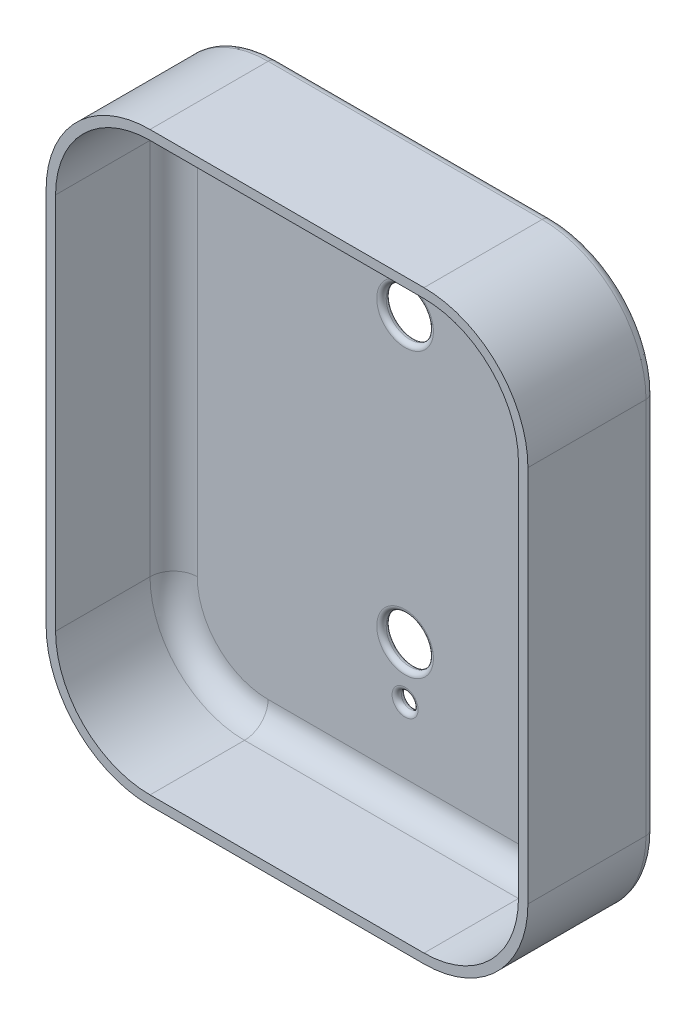
ISO-10303-21;
HEADER;
FILE_DESCRIPTION(('STEP AP214'),'2;1');
FILE_NAME('part.step','',(''),(''),'','','');
FILE_SCHEMA(('AUTOMOTIVE_DESIGN { 1 0 10303 214 1 1 1 1 }'));
ENDSEC;
DATA;
#1=APPLICATION_CONTEXT('core data for automotive mechanical design processes');
#2=APPLICATION_PROTOCOL_DEFINITION('international standard','automotive_design',2000,#1);
#3=PRODUCT_CONTEXT('',#1,'mechanical');
#4=PRODUCT('Part','Part','',(#3));
#5=PRODUCT_RELATED_PRODUCT_CATEGORY('part','',(#4));
#6=PRODUCT_DEFINITION_FORMATION('','',#4);
#7=PRODUCT_DEFINITION_CONTEXT('part definition',#1,'design');
#8=PRODUCT_DEFINITION('design','',#6,#7);
#9=PRODUCT_DEFINITION_SHAPE('','',#8);
#10=(LENGTH_UNIT() NAMED_UNIT(*) SI_UNIT(.MILLI.,.METRE.));
#11=(NAMED_UNIT(*) PLANE_ANGLE_UNIT() SI_UNIT($,.RADIAN.));
#12=(NAMED_UNIT(*) SI_UNIT($,.STERADIAN.) SOLID_ANGLE_UNIT());
#13=UNCERTAINTY_MEASURE_WITH_UNIT(LENGTH_MEASURE(1.E-05),#10,'distance_accuracy_value','');
#14=(GEOMETRIC_REPRESENTATION_CONTEXT(3) GLOBAL_UNCERTAINTY_ASSIGNED_CONTEXT((#13)) GLOBAL_UNIT_ASSIGNED_CONTEXT((#10,
#11,#12)) REPRESENTATION_CONTEXT('',''));
#15=CARTESIAN_POINT('',(0.,0.,0.));
#16=DIRECTION('',(0.,0.,1.));
#17=DIRECTION('',(1.,0.,0.));
#18=AXIS2_PLACEMENT_3D('',#15,#16,#17);
#19=CARTESIAN_POINT('',(-29.,40.,25.));
#20=DIRECTION('',(0.,0.,-1.));
#21=DIRECTION('',(-1.,0.,0.));
#22=AXIS2_PLACEMENT_3D('',#19,#20,#21);
#23=PLANE('',#22);
#24=CARTESIAN_POINT('',(-29.,40.,25.));
#25=DIRECTION('',(0.,0.,1.));
#26=DIRECTION('',(-1.,0.,0.));
#27=AXIS2_PLACEMENT_3D('',#24,#25,#26);
#28=CIRCLE('',#27,22.);
#29=CARTESIAN_POINT('',(-29.,62.,25.));
#30=VERTEX_POINT('',#29);
#31=CARTESIAN_POINT('',(-51.,40.,25.));
#32=VERTEX_POINT('',#31);
#33=EDGE_CURVE('E223',#30,#32,#28,.T.);
#34=ORIENTED_EDGE('',*,*,#33,.T.);
#35=DIRECTION('',(0.,-1.,0.));
#36=VECTOR('',#35,1.);
#37=CARTESIAN_POINT('',(-51.,40.,25.));
#38=LINE('',#37,#36);
#39=CARTESIAN_POINT('',(-51.,-40.,25.));
#40=VERTEX_POINT('',#39);
#41=EDGE_CURVE('E262',#32,#40,#38,.T.);
#42=ORIENTED_EDGE('',*,*,#41,.T.);
#43=CARTESIAN_POINT('',(-29.,-40.,25.));
#44=DIRECTION('',(0.,0.,1.));
#45=DIRECTION('',(-1.,0.,0.));
#46=AXIS2_PLACEMENT_3D('',#43,#44,#45);
#47=CIRCLE('',#46,22.);
#48=CARTESIAN_POINT('',(-29.,-62.,25.));
#49=VERTEX_POINT('',#48);
#50=EDGE_CURVE('E264',#40,#49,#47,.T.);
#51=ORIENTED_EDGE('',*,*,#50,.T.);
#52=DIRECTION('',(1.,0.,0.));
#53=VECTOR('',#52,1.);
#54=CARTESIAN_POINT('',(-29.,-62.,25.));
#55=LINE('',#54,#53);
#56=CARTESIAN_POINT('',(29.,-62.,25.));
#57=VERTEX_POINT('',#56);
#58=EDGE_CURVE('E266',#49,#57,#55,.T.);
#59=ORIENTED_EDGE('',*,*,#58,.T.);
#60=CARTESIAN_POINT('',(29.,-40.,25.));
#61=DIRECTION('',(0.,0.,1.));
#62=DIRECTION('',(-1.,0.,0.));
#63=AXIS2_PLACEMENT_3D('',#60,#61,#62);
#64=CIRCLE('',#63,22.);
#65=CARTESIAN_POINT('',(51.,-40.,25.));
#66=VERTEX_POINT('',#65);
#67=EDGE_CURVE('E268',#57,#66,#64,.T.);
#68=ORIENTED_EDGE('',*,*,#67,.T.);
#69=DIRECTION('',(0.,1.,0.));
#70=VECTOR('',#69,1.);
#71=CARTESIAN_POINT('',(51.,40.,25.));
#72=LINE('',#71,#70);
#73=CARTESIAN_POINT('',(51.,40.,25.));
#74=VERTEX_POINT('',#73);
#75=EDGE_CURVE('E270',#66,#74,#72,.T.);
#76=ORIENTED_EDGE('',*,*,#75,.T.);
#77=CARTESIAN_POINT('',(29.,40.,25.));
#78=DIRECTION('',(0.,0.,1.));
#79=DIRECTION('',(1.,0.,0.));
#80=AXIS2_PLACEMENT_3D('',#77,#78,#79);
#81=CIRCLE('',#80,22.);
#82=CARTESIAN_POINT('',(29.,62.,25.));
#83=VERTEX_POINT('',#82);
#84=EDGE_CURVE('E272',#74,#83,#81,.T.);
#85=ORIENTED_EDGE('',*,*,#84,.T.);
#86=DIRECTION('',(-1.,0.,0.));
#87=VECTOR('',#86,1.);
#88=CARTESIAN_POINT('',(-29.,62.,25.));
#89=LINE('',#88,#87);
#90=EDGE_CURVE('E274',#83,#30,#89,.T.);
#91=ORIENTED_EDGE('',*,*,#90,.T.);
#92=EDGE_LOOP('',(#34,#42,#51,#59,#68,#76,#85,#91));
#93=FACE_BOUND('',#92,.T.);
#94=CARTESIAN_POINT('',(29.,40.,25.));
#95=DIRECTION('',(0.,0.,1.));
#96=DIRECTION('',(1.,0.,0.));
#97=AXIS2_PLACEMENT_3D('',#94,#95,#96);
#98=CIRCLE('',#97,20.);
#99=CARTESIAN_POINT('',(49.,40.,25.));
#100=VERTEX_POINT('',#99);
#101=CARTESIAN_POINT('',(29.,60.,25.));
#102=VERTEX_POINT('',#101);
#103=EDGE_CURVE('E204',#100,#102,#98,.T.);
#104=ORIENTED_EDGE('',*,*,#103,.F.);
#105=DIRECTION('',(0.,1.,0.));
#106=VECTOR('',#105,1.);
#107=CARTESIAN_POINT('',(49.,40.,25.));
#108=LINE('',#107,#106);
#109=CARTESIAN_POINT('',(49.,-40.,25.));
#110=VERTEX_POINT('',#109);
#111=EDGE_CURVE('E241',#110,#100,#108,.T.);
#112=ORIENTED_EDGE('',*,*,#111,.F.);
#113=CARTESIAN_POINT('',(29.,-40.,25.));
#114=DIRECTION('',(0.,0.,1.));
#115=DIRECTION('',(-1.,0.,0.));
#116=AXIS2_PLACEMENT_3D('',#113,#114,#115);
#117=CIRCLE('',#116,20.);
#118=CARTESIAN_POINT('',(29.,-60.,25.));
#119=VERTEX_POINT('',#118);
#120=EDGE_CURVE('E238',#119,#110,#117,.T.);
#121=ORIENTED_EDGE('',*,*,#120,.F.);
#122=DIRECTION('',(1.,0.,0.));
#123=VECTOR('',#122,1.);
#124=CARTESIAN_POINT('',(-29.,-60.,25.));
#125=LINE('',#124,#123);
#126=CARTESIAN_POINT('',(-29.,-60.,25.));
#127=VERTEX_POINT('',#126);
#128=EDGE_CURVE('E236',#127,#119,#125,.T.);
#129=ORIENTED_EDGE('',*,*,#128,.F.);
#130=CARTESIAN_POINT('',(-29.,-40.,25.));
#131=DIRECTION('',(0.,0.,1.));
#132=DIRECTION('',(-1.,0.,0.));
#133=AXIS2_PLACEMENT_3D('',#130,#131,#132);
#134=CIRCLE('',#133,20.);
#135=CARTESIAN_POINT('',(-49.,-40.,25.));
#136=VERTEX_POINT('',#135);
#137=EDGE_CURVE('E234',#136,#127,#134,.T.);
#138=ORIENTED_EDGE('',*,*,#137,.F.);
#139=DIRECTION('',(0.,-1.,0.));
#140=VECTOR('',#139,1.);
#141=CARTESIAN_POINT('',(-49.,40.,25.));
#142=LINE('',#141,#140);
#143=CARTESIAN_POINT('',(-49.,40.,25.));
#144=VERTEX_POINT('',#143);
#145=EDGE_CURVE('E230',#144,#136,#142,.T.);
#146=ORIENTED_EDGE('',*,*,#145,.F.);
#147=CARTESIAN_POINT('',(-29.,40.,25.));
#148=DIRECTION('',(0.,0.,1.));
#149=DIRECTION('',(-1.,0.,0.));
#150=AXIS2_PLACEMENT_3D('',#147,#148,#149);
#151=CIRCLE('',#150,20.);
#152=CARTESIAN_POINT('',(-29.,60.,25.));
#153=VERTEX_POINT('',#152);
#154=EDGE_CURVE('E228',#153,#144,#151,.T.);
#155=ORIENTED_EDGE('',*,*,#154,.F.);
#156=DIRECTION('',(-1.,0.,0.));
#157=VECTOR('',#156,1.);
#158=CARTESIAN_POINT('',(-29.,60.,25.));
#159=LINE('',#158,#157);
#160=EDGE_CURVE('E214',#102,#153,#159,.T.);
#161=ORIENTED_EDGE('',*,*,#160,.F.);
#162=EDGE_LOOP('',(#104,#112,#121,#129,#138,#146,#155,#161));
#163=FACE_BOUND('',#162,.T.);
#164=ADVANCED_FACE('F37',(#93,#163),#23,.F.);
#165=CARTESIAN_POINT('',(-29.,40.,25.));
#166=DIRECTION('',(0.,0.,-1.));
#167=DIRECTION('',(-1.,0.,0.));
#168=AXIS2_PLACEMENT_3D('',#165,#166,#167);
#169=CYLINDRICAL_SURFACE('',#168,22.);
#170=DIRECTION('',(0.,0.,-1.));
#171=VECTOR('',#170,1.);
#172=CARTESIAN_POINT('',(-29.,62.,25.));
#173=LINE('',#172,#171);
#174=CARTESIAN_POINT('',(-29.,62.,0.));
#175=VERTEX_POINT('',#174);
#176=EDGE_CURVE('E276',#30,#175,#173,.T.);
#177=ORIENTED_EDGE('',*,*,#176,.T.);
#178=CARTESIAN_POINT('',(-29.,40.,0.));
#179=DIRECTION('',(0.,0.,-1.));
#180=DIRECTION('',(-1.,0.,0.));
#181=AXIS2_PLACEMENT_3D('',#178,#179,#180);
#182=CIRCLE('',#181,22.);
#183=CARTESIAN_POINT('',(-51.,40.,0.));
#184=VERTEX_POINT('',#183);
#185=EDGE_CURVE('E376',#175,#184,#182,.F.);
#186=ORIENTED_EDGE('',*,*,#185,.T.);
#187=DIRECTION('',(0.,0.,-1.));
#188=VECTOR('',#187,1.);
#189=CARTESIAN_POINT('',(-51.,40.,25.));
#190=LINE('',#189,#188);
#191=EDGE_CURVE('E295',#32,#184,#190,.T.);
#192=ORIENTED_EDGE('',*,*,#191,.F.);
#193=ORIENTED_EDGE('',*,*,#33,.F.);
#194=EDGE_LOOP('',(#177,#186,#192,#193));
#195=FACE_BOUND('',#194,.T.);
#196=ADVANCED_FACE('F452',(#195),#169,.T.);
#197=CARTESIAN_POINT('',(-51.,40.,25.));
#198=DIRECTION('',(1.,0.,0.));
#199=DIRECTION('',(0.,1.,0.));
#200=AXIS2_PLACEMENT_3D('',#197,#198,#199);
#201=PLANE('',#200);
#202=ORIENTED_EDGE('',*,*,#191,.T.);
#203=DIRECTION('',(0.,-1.,0.));
#204=VECTOR('',#203,1.);
#205=CARTESIAN_POINT('',(-51.,-40.,0.));
#206=LINE('',#205,#204);
#207=CARTESIAN_POINT('',(-51.,-40.,0.));
#208=VERTEX_POINT('',#207);
#209=EDGE_CURVE('E54',#184,#208,#206,.T.);
#210=ORIENTED_EDGE('',*,*,#209,.T.);
#211=DIRECTION('',(0.,0.,-1.));
#212=VECTOR('',#211,1.);
#213=CARTESIAN_POINT('',(-51.,-40.,25.));
#214=LINE('',#213,#212);
#215=EDGE_CURVE('E293',#40,#208,#214,.T.);
#216=ORIENTED_EDGE('',*,*,#215,.F.);
#217=ORIENTED_EDGE('',*,*,#41,.F.);
#218=EDGE_LOOP('',(#202,#210,#216,#217));
#219=FACE_BOUND('',#218,.T.);
#220=ADVANCED_FACE('F458',(#219),#201,.F.);
#221=CARTESIAN_POINT('',(-29.,-40.,25.));
#222=DIRECTION('',(0.,0.,-1.));
#223=DIRECTION('',(-1.,0.,0.));
#224=AXIS2_PLACEMENT_3D('',#221,#222,#223);
#225=CYLINDRICAL_SURFACE('',#224,22.);
#226=ORIENTED_EDGE('',*,*,#215,.T.);
#227=CARTESIAN_POINT('',(-29.,-40.,0.));
#228=DIRECTION('',(0.,0.,-1.));
#229=DIRECTION('',(-1.,0.,0.));
#230=AXIS2_PLACEMENT_3D('',#227,#228,#229);
#231=CIRCLE('',#230,22.);
#232=CARTESIAN_POINT('',(-29.,-62.,0.));
#233=VERTEX_POINT('',#232);
#234=EDGE_CURVE('E61',#208,#233,#231,.F.);
#235=ORIENTED_EDGE('',*,*,#234,.T.);
#236=DIRECTION('',(0.,0.,-1.));
#237=VECTOR('',#236,1.);
#238=CARTESIAN_POINT('',(-29.,-62.,25.));
#239=LINE('',#238,#237);
#240=EDGE_CURVE('E291',#49,#233,#239,.T.);
#241=ORIENTED_EDGE('',*,*,#240,.F.);
#242=ORIENTED_EDGE('',*,*,#50,.F.);
#243=EDGE_LOOP('',(#226,#235,#241,#242));
#244=FACE_BOUND('',#243,.T.);
#245=ADVANCED_FACE('F483',(#244),#225,.T.);
#246=CARTESIAN_POINT('',(-29.,-62.,25.));
#247=DIRECTION('',(0.,1.,0.));
#248=DIRECTION('',(-1.,0.,0.));
#249=AXIS2_PLACEMENT_3D('',#246,#247,#248);
#250=PLANE('',#249);
#251=ORIENTED_EDGE('',*,*,#240,.T.);
#252=DIRECTION('',(1.,0.,0.));
#253=VECTOR('',#252,1.);
#254=CARTESIAN_POINT('',(29.,-62.,0.));
#255=LINE('',#254,#253);
#256=CARTESIAN_POINT('',(29.,-62.,0.));
#257=VERTEX_POINT('',#256);
#258=EDGE_CURVE('E380',#233,#257,#255,.T.);
#259=ORIENTED_EDGE('',*,*,#258,.T.);
#260=DIRECTION('',(0.,0.,-1.));
#261=VECTOR('',#260,1.);
#262=CARTESIAN_POINT('',(29.,-62.,25.));
#263=LINE('',#262,#261);
#264=EDGE_CURVE('E288',#57,#257,#263,.T.);
#265=ORIENTED_EDGE('',*,*,#264,.F.);
#266=ORIENTED_EDGE('',*,*,#58,.F.);
#267=EDGE_LOOP('',(#251,#259,#265,#266));
#268=FACE_BOUND('',#267,.T.);
#269=ADVANCED_FACE('F479',(#268),#250,.F.);
#270=CARTESIAN_POINT('',(29.,-40.,25.));
#271=DIRECTION('',(0.,0.,-1.));
#272=DIRECTION('',(-1.,0.,0.));
#273=AXIS2_PLACEMENT_3D('',#270,#271,#272);
#274=CYLINDRICAL_SURFACE('',#273,22.);
#275=ORIENTED_EDGE('',*,*,#264,.T.);
#276=CARTESIAN_POINT('',(29.,-40.,0.));
#277=DIRECTION('',(0.,0.,-1.));
#278=DIRECTION('',(-1.,0.,0.));
#279=AXIS2_PLACEMENT_3D('',#276,#277,#278);
#280=CIRCLE('',#279,22.);
#281=CARTESIAN_POINT('',(51.,-40.,0.));
#282=VERTEX_POINT('',#281);
#283=EDGE_CURVE('E378',#257,#282,#280,.F.);
#284=ORIENTED_EDGE('',*,*,#283,.T.);
#285=DIRECTION('',(0.,0.,-1.));
#286=VECTOR('',#285,1.);
#287=CARTESIAN_POINT('',(51.,-40.,25.));
#288=LINE('',#287,#286);
#289=EDGE_CURVE('E285',#66,#282,#288,.T.);
#290=ORIENTED_EDGE('',*,*,#289,.F.);
#291=ORIENTED_EDGE('',*,*,#67,.F.);
#292=EDGE_LOOP('',(#275,#284,#290,#291));
#293=FACE_BOUND('',#292,.T.);
#294=ADVANCED_FACE('F475',(#293),#274,.T.);
#295=CARTESIAN_POINT('',(51.,40.,25.));
#296=DIRECTION('',(-1.,0.,0.));
#297=DIRECTION('',(0.,-1.,0.));
#298=AXIS2_PLACEMENT_3D('',#295,#296,#297);
#299=PLANE('',#298);
#300=ORIENTED_EDGE('',*,*,#289,.T.);
#301=DIRECTION('',(0.,1.,0.));
#302=VECTOR('',#301,1.);
#303=CARTESIAN_POINT('',(51.,40.,0.));
#304=LINE('',#303,#302);
#305=CARTESIAN_POINT('',(51.,40.,0.));
#306=VERTEX_POINT('',#305);
#307=EDGE_CURVE('E330',#282,#306,#304,.T.);
#308=ORIENTED_EDGE('',*,*,#307,.T.);
#309=DIRECTION('',(0.,0.,-1.));
#310=VECTOR('',#309,1.);
#311=CARTESIAN_POINT('',(51.,40.,25.));
#312=LINE('',#311,#310);
#313=EDGE_CURVE('E282',#74,#306,#312,.T.);
#314=ORIENTED_EDGE('',*,*,#313,.F.);
#315=ORIENTED_EDGE('',*,*,#75,.F.);
#316=EDGE_LOOP('',(#300,#308,#314,#315));
#317=FACE_BOUND('',#316,.T.);
#318=ADVANCED_FACE('F471',(#317),#299,.F.);
#319=CARTESIAN_POINT('',(29.,40.,25.));
#320=DIRECTION('',(0.,0.,-1.));
#321=DIRECTION('',(-1.,0.,0.));
#322=AXIS2_PLACEMENT_3D('',#319,#320,#321);
#323=CYLINDRICAL_SURFACE('',#322,22.);
#324=ORIENTED_EDGE('',*,*,#313,.T.);
#325=CARTESIAN_POINT('',(29.,40.,0.));
#326=DIRECTION('',(0.,0.,-1.));
#327=DIRECTION('',(-1.,0.,0.));
#328=AXIS2_PLACEMENT_3D('',#325,#326,#327);
#329=CIRCLE('',#328,22.);
#330=CARTESIAN_POINT('',(29.,62.,0.));
#331=VERTEX_POINT('',#330);
#332=EDGE_CURVE('E372',#306,#331,#329,.F.);
#333=ORIENTED_EDGE('',*,*,#332,.T.);
#334=DIRECTION('',(0.,0.,-1.));
#335=VECTOR('',#334,1.);
#336=CARTESIAN_POINT('',(29.,62.,25.));
#337=LINE('',#336,#335);
#338=EDGE_CURVE('E279',#83,#331,#337,.T.);
#339=ORIENTED_EDGE('',*,*,#338,.F.);
#340=ORIENTED_EDGE('',*,*,#84,.F.);
#341=EDGE_LOOP('',(#324,#333,#339,#340));
#342=FACE_BOUND('',#341,.T.);
#343=ADVANCED_FACE('F467',(#342),#323,.T.);
#344=CARTESIAN_POINT('',(-29.,62.,25.));
#345=DIRECTION('',(0.,-1.,0.));
#346=DIRECTION('',(0.,0.,-1.));
#347=AXIS2_PLACEMENT_3D('',#344,#345,#346);
#348=PLANE('',#347);
#349=ORIENTED_EDGE('',*,*,#338,.T.);
#350=DIRECTION('',(-1.,0.,0.));
#351=VECTOR('',#350,1.);
#352=CARTESIAN_POINT('',(-29.,62.,0.));
#353=LINE('',#352,#351);
#354=EDGE_CURVE('E374',#331,#175,#353,.T.);
#355=ORIENTED_EDGE('',*,*,#354,.T.);
#356=ORIENTED_EDGE('',*,*,#176,.F.);
#357=ORIENTED_EDGE('',*,*,#90,.F.);
#358=EDGE_LOOP('',(#349,#355,#356,#357));
#359=FACE_BOUND('',#358,.T.);
#360=ADVANCED_FACE('F464',(#359),#348,.F.);
#361=CARTESIAN_POINT('',(29.,40.,25.));
#362=DIRECTION('',(0.,0.,-1.));
#363=DIRECTION('',(-1.,0.,0.));
#364=AXIS2_PLACEMENT_3D('',#361,#362,#363);
#365=CYLINDRICAL_SURFACE('',#364,20.);
#366=DIRECTION('',(0.,0.,-1.));
#367=VECTOR('',#366,1.);
#368=CARTESIAN_POINT('',(29.,60.,25.));
#369=LINE('',#368,#367);
#370=CARTESIAN_POINT('',(29.,60.,5.));
#371=VERTEX_POINT('',#370);
#372=EDGE_CURVE('E207',#102,#371,#369,.T.);
#373=ORIENTED_EDGE('',*,*,#372,.T.);
#374=CARTESIAN_POINT('',(29.,40.,5.));
#375=DIRECTION('',(0.,0.,-1.));
#376=DIRECTION('',(-1.,0.,0.));
#377=AXIS2_PLACEMENT_3D('',#374,#375,#376);
#378=CIRCLE('',#377,20.);
#379=CARTESIAN_POINT('',(49.,40.,5.));
#380=VERTEX_POINT('',#379);
#381=EDGE_CURVE('E324',#371,#380,#378,.T.);
#382=ORIENTED_EDGE('',*,*,#381,.T.);
#383=DIRECTION('',(0.,0.,-1.));
#384=VECTOR('',#383,1.);
#385=CARTESIAN_POINT('',(49.,40.,25.));
#386=LINE('',#385,#384);
#387=EDGE_CURVE('E210',#100,#380,#386,.T.);
#388=ORIENTED_EDGE('',*,*,#387,.F.);
#389=ORIENTED_EDGE('',*,*,#103,.T.);
#390=EDGE_LOOP('',(#373,#382,#388,#389));
#391=FACE_BOUND('',#390,.T.);
#392=ADVANCED_FACE('F206',(#391),#365,.F.);
#393=CARTESIAN_POINT('',(-29.,60.,25.));
#394=DIRECTION('',(0.,-1.,0.));
#395=DIRECTION('',(1.,0.,0.));
#396=AXIS2_PLACEMENT_3D('',#393,#394,#395);
#397=PLANE('',#396);
#398=DIRECTION('',(0.,0.,-1.));
#399=VECTOR('',#398,1.);
#400=CARTESIAN_POINT('',(-29.,60.,25.));
#401=LINE('',#400,#399);
#402=CARTESIAN_POINT('',(-29.,60.,5.));
#403=VERTEX_POINT('',#402);
#404=EDGE_CURVE('E224',#153,#403,#401,.T.);
#405=ORIENTED_EDGE('',*,*,#404,.T.);
#406=DIRECTION('',(-1.,0.,0.));
#407=VECTOR('',#406,1.);
#408=CARTESIAN_POINT('',(-29.,60.,5.));
#409=LINE('',#408,#407);
#410=EDGE_CURVE('E222',#403,#371,#409,.F.);
#411=ORIENTED_EDGE('',*,*,#410,.T.);
#412=ORIENTED_EDGE('',*,*,#372,.F.);
#413=ORIENTED_EDGE('',*,*,#160,.T.);
#414=EDGE_LOOP('',(#405,#411,#412,#413));
#415=FACE_BOUND('',#414,.T.);
#416=ADVANCED_FACE('F219',(#415),#397,.T.);
#417=CARTESIAN_POINT('',(-29.,40.,25.));
#418=DIRECTION('',(0.,0.,-1.));
#419=DIRECTION('',(-1.,0.,0.));
#420=AXIS2_PLACEMENT_3D('',#417,#418,#419);
#421=CYLINDRICAL_SURFACE('',#420,20.);
#422=DIRECTION('',(0.,0.,-1.));
#423=VECTOR('',#422,1.);
#424=CARTESIAN_POINT('',(-49.,40.,25.));
#425=LINE('',#424,#423);
#426=CARTESIAN_POINT('',(-49.,40.,5.));
#427=VERTEX_POINT('',#426);
#428=EDGE_CURVE('E256',#144,#427,#425,.T.);
#429=ORIENTED_EDGE('',*,*,#428,.T.);
#430=CARTESIAN_POINT('',(-29.,40.,5.));
#431=DIRECTION('',(0.,0.,-1.));
#432=DIRECTION('',(-1.,0.,0.));
#433=AXIS2_PLACEMENT_3D('',#430,#431,#432);
#434=CIRCLE('',#433,20.);
#435=EDGE_CURVE('E321',#427,#403,#434,.T.);
#436=ORIENTED_EDGE('',*,*,#435,.T.);
#437=ORIENTED_EDGE('',*,*,#404,.F.);
#438=ORIENTED_EDGE('',*,*,#154,.T.);
#439=EDGE_LOOP('',(#429,#436,#437,#438));
#440=FACE_BOUND('',#439,.T.);
#441=ADVANCED_FACE('F644',(#440),#421,.F.);
#442=CARTESIAN_POINT('',(-49.,40.,25.));
#443=DIRECTION('',(1.,0.,0.));
#444=DIRECTION('',(0.,1.,0.));
#445=AXIS2_PLACEMENT_3D('',#442,#443,#444);
#446=PLANE('',#445);
#447=DIRECTION('',(0.,0.,-1.));
#448=VECTOR('',#447,1.);
#449=CARTESIAN_POINT('',(-49.,-40.,25.));
#450=LINE('',#449,#448);
#451=CARTESIAN_POINT('',(-49.,-40.,5.));
#452=VERTEX_POINT('',#451);
#453=EDGE_CURVE('E253',#136,#452,#450,.T.);
#454=ORIENTED_EDGE('',*,*,#453,.T.);
#455=DIRECTION('',(0.,-1.,0.));
#456=VECTOR('',#455,1.);
#457=CARTESIAN_POINT('',(-49.,40.,5.));
#458=LINE('',#457,#456);
#459=EDGE_CURVE('E319',#452,#427,#458,.F.);
#460=ORIENTED_EDGE('',*,*,#459,.T.);
#461=ORIENTED_EDGE('',*,*,#428,.F.);
#462=ORIENTED_EDGE('',*,*,#145,.T.);
#463=EDGE_LOOP('',(#454,#460,#461,#462));
#464=FACE_BOUND('',#463,.T.);
#465=ADVANCED_FACE('F640',(#464),#446,.T.);
#466=CARTESIAN_POINT('',(-29.,-40.,25.));
#467=DIRECTION('',(0.,0.,-1.));
#468=DIRECTION('',(-1.,0.,0.));
#469=AXIS2_PLACEMENT_3D('',#466,#467,#468);
#470=CYLINDRICAL_SURFACE('',#469,20.);
#471=DIRECTION('',(0.,0.,-1.));
#472=VECTOR('',#471,1.);
#473=CARTESIAN_POINT('',(-29.,-60.,25.));
#474=LINE('',#473,#472);
#475=CARTESIAN_POINT('',(-29.,-60.,5.));
#476=VERTEX_POINT('',#475);
#477=EDGE_CURVE('E250',#127,#476,#474,.T.);
#478=ORIENTED_EDGE('',*,*,#477,.T.);
#479=CARTESIAN_POINT('',(-29.,-40.,5.));
#480=DIRECTION('',(0.,0.,-1.));
#481=DIRECTION('',(-1.,0.,0.));
#482=AXIS2_PLACEMENT_3D('',#479,#480,#481);
#483=CIRCLE('',#482,20.);
#484=EDGE_CURVE('E317',#476,#452,#483,.T.);
#485=ORIENTED_EDGE('',*,*,#484,.T.);
#486=ORIENTED_EDGE('',*,*,#453,.F.);
#487=ORIENTED_EDGE('',*,*,#137,.T.);
#488=EDGE_LOOP('',(#478,#485,#486,#487));
#489=FACE_BOUND('',#488,.T.);
#490=ADVANCED_FACE('F636',(#489),#470,.F.);
#491=CARTESIAN_POINT('',(-29.,-60.,25.));
#492=DIRECTION('',(0.,1.,0.));
#493=DIRECTION('',(-1.,0.,0.));
#494=AXIS2_PLACEMENT_3D('',#491,#492,#493);
#495=PLANE('',#494);
#496=DIRECTION('',(0.,0.,-1.));
#497=VECTOR('',#496,1.);
#498=CARTESIAN_POINT('',(29.,-60.,25.));
#499=LINE('',#498,#497);
#500=CARTESIAN_POINT('',(29.,-60.,5.));
#501=VERTEX_POINT('',#500);
#502=EDGE_CURVE('E247',#119,#501,#499,.T.);
#503=ORIENTED_EDGE('',*,*,#502,.T.);
#504=DIRECTION('',(1.,0.,0.));
#505=VECTOR('',#504,1.);
#506=CARTESIAN_POINT('',(-29.,-60.,5.));
#507=LINE('',#506,#505);
#508=EDGE_CURVE('E314',#501,#476,#507,.F.);
#509=ORIENTED_EDGE('',*,*,#508,.T.);
#510=ORIENTED_EDGE('',*,*,#477,.F.);
#511=ORIENTED_EDGE('',*,*,#128,.T.);
#512=EDGE_LOOP('',(#503,#509,#510,#511));
#513=FACE_BOUND('',#512,.T.);
#514=ADVANCED_FACE('F632',(#513),#495,.T.);
#515=CARTESIAN_POINT('',(29.,-40.,25.));
#516=DIRECTION('',(0.,0.,-1.));
#517=DIRECTION('',(-1.,0.,0.));
#518=AXIS2_PLACEMENT_3D('',#515,#516,#517);
#519=CYLINDRICAL_SURFACE('',#518,20.);
#520=DIRECTION('',(0.,0.,-1.));
#521=VECTOR('',#520,1.);
#522=CARTESIAN_POINT('',(49.,-40.,25.));
#523=LINE('',#522,#521);
#524=CARTESIAN_POINT('',(49.,-40.,5.));
#525=VERTEX_POINT('',#524);
#526=EDGE_CURVE('E244',#110,#525,#523,.T.);
#527=ORIENTED_EDGE('',*,*,#526,.T.);
#528=CARTESIAN_POINT('',(29.,-40.,5.));
#529=DIRECTION('',(0.,0.,-1.));
#530=DIRECTION('',(-1.,0.,0.));
#531=AXIS2_PLACEMENT_3D('',#528,#529,#530);
#532=CIRCLE('',#531,20.);
#533=EDGE_CURVE('E328',#525,#501,#532,.T.);
#534=ORIENTED_EDGE('',*,*,#533,.T.);
#535=ORIENTED_EDGE('',*,*,#502,.F.);
#536=ORIENTED_EDGE('',*,*,#120,.T.);
#537=EDGE_LOOP('',(#527,#534,#535,#536));
#538=FACE_BOUND('',#537,.T.);
#539=ADVANCED_FACE('F628',(#538),#519,.F.);
#540=CARTESIAN_POINT('',(49.,40.,25.));
#541=DIRECTION('',(-1.,0.,0.));
#542=DIRECTION('',(0.,0.,1.));
#543=AXIS2_PLACEMENT_3D('',#540,#541,#542);
#544=PLANE('',#543);
#545=ORIENTED_EDGE('',*,*,#387,.T.);
#546=DIRECTION('',(0.,1.,0.));
#547=VECTOR('',#546,1.);
#548=CARTESIAN_POINT('',(49.,40.,5.));
#549=LINE('',#548,#547);
#550=EDGE_CURVE('E326',#380,#525,#549,.F.);
#551=ORIENTED_EDGE('',*,*,#550,.T.);
#552=ORIENTED_EDGE('',*,*,#526,.F.);
#553=ORIENTED_EDGE('',*,*,#111,.T.);
#554=EDGE_LOOP('',(#545,#551,#552,#553));
#555=FACE_BOUND('',#554,.T.);
#556=ADVANCED_FACE('F621',(#555),#544,.T.);
#557=CARTESIAN_POINT('',(-29.,40.,0.));
#558=DIRECTION('',(0.,0.,-1.));
#559=DIRECTION('',(-1.,0.,0.));
#560=AXIS2_PLACEMENT_3D('',#557,#558,#559);
#561=PLANE('',#560);
#562=CARTESIAN_POINT('',(0.,-41.,0.));
#563=DIRECTION('',(0.,0.,-1.));
#564=DIRECTION('',(-1.,0.,0.));
#565=AXIS2_PLACEMENT_3D('',#562,#563,#564);
#566=CIRCLE('',#565,2.75);
#567=CARTESIAN_POINT('',(-2.74999999999999,-41.,0.));
#568=VERTEX_POINT('',#567);
#569=EDGE_CURVE('E11',#568,#568,#566,.T.);
#570=ORIENTED_EDGE('',*,*,#569,.T.);
#571=EDGE_LOOP('',(#570));
#572=FACE_BOUND('',#571,.T.);
#573=CARTESIAN_POINT('',(0.,-30.,0.));
#574=DIRECTION('',(0.,0.,-1.));
#575=DIRECTION('',(-1.,0.,0.));
#576=AXIS2_PLACEMENT_3D('',#573,#574,#575);
#577=CIRCLE('',#576,6.);
#578=CARTESIAN_POINT('',(-6.,-30.,0.));
#579=VERTEX_POINT('',#578);
#580=EDGE_CURVE('E46',#579,#579,#577,.T.);
#581=ORIENTED_EDGE('',*,*,#580,.T.);
#582=EDGE_LOOP('',(#581));
#583=FACE_BOUND('',#582,.T.);
#584=CARTESIAN_POINT('',(0.,30.,0.));
#585=DIRECTION('',(0.,0.,-1.));
#586=DIRECTION('',(-1.,0.,0.));
#587=AXIS2_PLACEMENT_3D('',#584,#585,#586);
#588=CIRCLE('',#587,6.);
#589=CARTESIAN_POINT('',(-6.,30.,0.));
#590=VERTEX_POINT('',#589);
#591=EDGE_CURVE('E421',#590,#590,#588,.T.);
#592=ORIENTED_EDGE('',*,*,#591,.T.);
#593=EDGE_LOOP('',(#592));
#594=FACE_BOUND('',#593,.T.);
#595=CARTESIAN_POINT('',(0.,41.,0.));
#596=DIRECTION('',(0.,0.,-1.));
#597=DIRECTION('',(-1.,0.,0.));
#598=AXIS2_PLACEMENT_3D('',#595,#596,#597);
#599=CIRCLE('',#598,2.75);
#600=CARTESIAN_POINT('',(-2.74999999999999,41.,0.));
#601=VERTEX_POINT('',#600);
#602=EDGE_CURVE('E418',#601,#601,#599,.T.);
#603=ORIENTED_EDGE('',*,*,#602,.T.);
#604=EDGE_LOOP('',(#603));
#605=FACE_BOUND('',#604,.T.);
#606=CARTESIAN_POINT('',(-29.,-40.,0.));
#607=DIRECTION('',(0.,0.,-1.));
#608=DIRECTION('',(-1.,0.,0.));
#609=AXIS2_PLACEMENT_3D('',#606,#607,#608);
#610=CIRCLE('',#609,15.);
#611=CARTESIAN_POINT('',(-44.,-40.,0.));
#612=VERTEX_POINT('',#611);
#613=CARTESIAN_POINT('',(-29.,-55.,0.));
#614=VERTEX_POINT('',#613);
#615=EDGE_CURVE('E309',#612,#614,#610,.F.);
#616=ORIENTED_EDGE('',*,*,#615,.T.);
#617=DIRECTION('',(1.,0.,0.));
#618=VECTOR('',#617,1.);
#619=CARTESIAN_POINT('',(-29.,-55.,0.));
#620=LINE('',#619,#618);
#621=CARTESIAN_POINT('',(29.,-55.,0.));
#622=VERTEX_POINT('',#621);
#623=EDGE_CURVE('E311',#614,#622,#620,.T.);
#624=ORIENTED_EDGE('',*,*,#623,.T.);
#625=CARTESIAN_POINT('',(29.,-40.,0.));
#626=DIRECTION('',(0.,0.,-1.));
#627=DIRECTION('',(-1.,0.,0.));
#628=AXIS2_PLACEMENT_3D('',#625,#626,#627);
#629=CIRCLE('',#628,15.);
#630=CARTESIAN_POINT('',(44.,-40.,0.));
#631=VERTEX_POINT('',#630);
#632=EDGE_CURVE('E297',#622,#631,#629,.F.);
#633=ORIENTED_EDGE('',*,*,#632,.T.);
#634=DIRECTION('',(0.,1.,0.));
#635=VECTOR('',#634,1.);
#636=CARTESIAN_POINT('',(44.,40.,0.));
#637=LINE('',#636,#635);
#638=CARTESIAN_POINT('',(44.,40.,0.));
#639=VERTEX_POINT('',#638);
#640=EDGE_CURVE('E299',#631,#639,#637,.T.);
#641=ORIENTED_EDGE('',*,*,#640,.T.);
#642=CARTESIAN_POINT('',(29.,40.,0.));
#643=DIRECTION('',(0.,0.,-1.));
#644=DIRECTION('',(-1.,0.,0.));
#645=AXIS2_PLACEMENT_3D('',#642,#643,#644);
#646=CIRCLE('',#645,15.);
#647=CARTESIAN_POINT('',(29.,55.,0.));
#648=VERTEX_POINT('',#647);
#649=EDGE_CURVE('E301',#639,#648,#646,.F.);
#650=ORIENTED_EDGE('',*,*,#649,.T.);
#651=DIRECTION('',(-1.,0.,0.));
#652=VECTOR('',#651,1.);
#653=CARTESIAN_POINT('',(-29.,55.,0.));
#654=LINE('',#653,#652);
#655=CARTESIAN_POINT('',(-29.,55.,0.));
#656=VERTEX_POINT('',#655);
#657=EDGE_CURVE('E303',#648,#656,#654,.T.);
#658=ORIENTED_EDGE('',*,*,#657,.T.);
#659=CARTESIAN_POINT('',(-29.,40.,0.));
#660=DIRECTION('',(0.,0.,-1.));
#661=DIRECTION('',(-1.,0.,0.));
#662=AXIS2_PLACEMENT_3D('',#659,#660,#661);
#663=CIRCLE('',#662,15.);
#664=CARTESIAN_POINT('',(-44.,40.,0.));
#665=VERTEX_POINT('',#664);
#666=EDGE_CURVE('E305',#656,#665,#663,.F.);
#667=ORIENTED_EDGE('',*,*,#666,.T.);
#668=DIRECTION('',(0.,-1.,0.));
#669=VECTOR('',#668,1.);
#670=CARTESIAN_POINT('',(-44.,40.,0.));
#671=LINE('',#670,#669);
#672=EDGE_CURVE('E307',#665,#612,#671,.T.);
#673=ORIENTED_EDGE('',*,*,#672,.T.);
#674=EDGE_LOOP('',(#616,#624,#633,#641,#650,#658,#667,#673));
#675=FACE_BOUND('',#674,.T.);
#676=ADVANCED_FACE('F579',(#572,#583,#594,#605,#675),#561,.F.);
#677=CARTESIAN_POINT('',(-29.,40.,-2.));
#678=DIRECTION('',(0.,0.,-1.));
#679=DIRECTION('',(-1.,0.,0.));
#680=AXIS2_PLACEMENT_3D('',#677,#678,#679);
#681=PLANE('',#680);
#682=CARTESIAN_POINT('',(0.,-41.,-2.));
#683=DIRECTION('',(0.,0.,-1.));
#684=DIRECTION('',(-1.,0.,0.));
#685=AXIS2_PLACEMENT_3D('',#682,#683,#684);
#686=CIRCLE('',#685,2.75);
#687=CARTESIAN_POINT('',(-2.74999999999999,-41.,-2.));
#688=VERTEX_POINT('',#687);
#689=EDGE_CURVE('E415',#688,#688,#686,.F.);
#690=ORIENTED_EDGE('',*,*,#689,.T.);
#691=EDGE_LOOP('',(#690));
#692=FACE_BOUND('',#691,.T.);
#693=CARTESIAN_POINT('',(0.,-30.,-2.));
#694=DIRECTION('',(0.,0.,-1.));
#695=DIRECTION('',(-1.,0.,0.));
#696=AXIS2_PLACEMENT_3D('',#693,#694,#695);
#697=CIRCLE('',#696,6.);
#698=CARTESIAN_POINT('',(-6.,-30.,-2.));
#699=VERTEX_POINT('',#698);
#700=EDGE_CURVE('E412',#699,#699,#697,.F.);
#701=ORIENTED_EDGE('',*,*,#700,.T.);
#702=EDGE_LOOP('',(#701));
#703=FACE_BOUND('',#702,.T.);
#704=CARTESIAN_POINT('',(0.,30.,-2.));
#705=DIRECTION('',(0.,0.,-1.));
#706=DIRECTION('',(-1.,0.,0.));
#707=AXIS2_PLACEMENT_3D('',#704,#705,#706);
#708=CIRCLE('',#707,6.);
#709=CARTESIAN_POINT('',(-6.,30.,-2.));
#710=VERTEX_POINT('',#709);
#711=EDGE_CURVE('E409',#710,#710,#708,.F.);
#712=ORIENTED_EDGE('',*,*,#711,.T.);
#713=EDGE_LOOP('',(#712));
#714=FACE_BOUND('',#713,.T.);
#715=CARTESIAN_POINT('',(0.,41.,-2.));
#716=DIRECTION('',(0.,0.,-1.));
#717=DIRECTION('',(-1.,0.,0.));
#718=AXIS2_PLACEMENT_3D('',#715,#716,#717);
#719=CIRCLE('',#718,2.75);
#720=CARTESIAN_POINT('',(-2.74999999999999,41.,-2.));
#721=VERTEX_POINT('',#720);
#722=EDGE_CURVE('E384',#721,#721,#719,.F.);
#723=ORIENTED_EDGE('',*,*,#722,.T.);
#724=EDGE_LOOP('',(#723));
#725=FACE_BOUND('',#724,.T.);
#726=CARTESIAN_POINT('',(29.,40.,-2.));
#727=DIRECTION('',(0.,0.,-1.));
#728=DIRECTION('',(-1.,0.,0.));
#729=AXIS2_PLACEMENT_3D('',#726,#727,#728);
#730=CIRCLE('',#729,20.);
#731=CARTESIAN_POINT('',(29.,60.,-2.));
#732=VERTEX_POINT('',#731);
#733=CARTESIAN_POINT('',(49.,40.,-2.));
#734=VERTEX_POINT('',#733);
#735=EDGE_CURVE('E367',#732,#734,#730,.T.);
#736=ORIENTED_EDGE('',*,*,#735,.T.);
#737=DIRECTION('',(0.,1.,0.));
#738=VECTOR('',#737,1.);
#739=CARTESIAN_POINT('',(49.,-40.,-2.));
#740=LINE('',#739,#738);
#741=CARTESIAN_POINT('',(49.,-40.,-2.));
#742=VERTEX_POINT('',#741);
#743=EDGE_CURVE('E369',#734,#742,#740,.F.);
#744=ORIENTED_EDGE('',*,*,#743,.T.);
#745=CARTESIAN_POINT('',(29.,-40.,-2.));
#746=DIRECTION('',(0.,0.,-1.));
#747=DIRECTION('',(-1.,0.,0.));
#748=AXIS2_PLACEMENT_3D('',#745,#746,#747);
#749=CIRCLE('',#748,20.);
#750=CARTESIAN_POINT('',(29.,-60.,-2.));
#751=VERTEX_POINT('',#750);
#752=EDGE_CURVE('E361',#742,#751,#749,.T.);
#753=ORIENTED_EDGE('',*,*,#752,.T.);
#754=DIRECTION('',(1.,0.,0.));
#755=VECTOR('',#754,1.);
#756=CARTESIAN_POINT('',(-29.,-60.,-2.));
#757=LINE('',#756,#755);
#758=CARTESIAN_POINT('',(-29.,-60.,-2.));
#759=VERTEX_POINT('',#758);
#760=EDGE_CURVE('E359',#751,#759,#757,.F.);
#761=ORIENTED_EDGE('',*,*,#760,.T.);
#762=CARTESIAN_POINT('',(-29.,-40.,-2.));
#763=DIRECTION('',(0.,0.,-1.));
#764=DIRECTION('',(-1.,0.,0.));
#765=AXIS2_PLACEMENT_3D('',#762,#763,#764);
#766=CIRCLE('',#765,20.);
#767=CARTESIAN_POINT('',(-49.,-40.,-2.));
#768=VERTEX_POINT('',#767);
#769=EDGE_CURVE('E357',#759,#768,#766,.T.);
#770=ORIENTED_EDGE('',*,*,#769,.T.);
#771=DIRECTION('',(0.,-1.,0.));
#772=VECTOR('',#771,1.);
#773=CARTESIAN_POINT('',(-49.,40.,-2.));
#774=LINE('',#773,#772);
#775=CARTESIAN_POINT('',(-49.,40.,-2.));
#776=VERTEX_POINT('',#775);
#777=EDGE_CURVE('E355',#768,#776,#774,.F.);
#778=ORIENTED_EDGE('',*,*,#777,.T.);
#779=CARTESIAN_POINT('',(-29.,40.,-2.));
#780=DIRECTION('',(0.,0.,-1.));
#781=DIRECTION('',(-1.,0.,0.));
#782=AXIS2_PLACEMENT_3D('',#779,#780,#781);
#783=CIRCLE('',#782,20.);
#784=CARTESIAN_POINT('',(-29.,60.,-2.));
#785=VERTEX_POINT('',#784);
#786=EDGE_CURVE('E363',#776,#785,#783,.T.);
#787=ORIENTED_EDGE('',*,*,#786,.T.);
#788=DIRECTION('',(-1.,0.,0.));
#789=VECTOR('',#788,1.);
#790=CARTESIAN_POINT('',(29.,60.,-2.));
#791=LINE('',#790,#789);
#792=EDGE_CURVE('E365',#785,#732,#791,.F.);
#793=ORIENTED_EDGE('',*,*,#792,.T.);
#794=EDGE_LOOP('',(#736,#744,#753,#761,#770,#778,#787,#793));
#795=FACE_BOUND('',#794,.T.);
#796=ADVANCED_FACE('F521',(#692,#703,#714,#725,#795),#681,.T.);
#797=CARTESIAN_POINT('',(-29.,55.,5.));
#798=DIRECTION('',(-1.,0.,0.));
#799=DIRECTION('',(0.,-1.,0.));
#800=AXIS2_PLACEMENT_3D('',#797,#798,#799);
#801=CYLINDRICAL_SURFACE('',#800,5.);
#802=CARTESIAN_POINT('',(29.,55.,5.));
#803=DIRECTION('',(-1.,0.,0.));
#804=DIRECTION('',(0.,0.,1.));
#805=AXIS2_PLACEMENT_3D('',#802,#803,#804);
#806=CIRCLE('',#805,5.);
#807=EDGE_CURVE('E348',#371,#648,#806,.T.);
#808=ORIENTED_EDGE('',*,*,#807,.F.);
#809=ORIENTED_EDGE('',*,*,#410,.F.);
#810=CARTESIAN_POINT('',(-29.,55.,5.));
#811=DIRECTION('',(1.,0.,0.));
#812=DIRECTION('',(0.,0.,-1.));
#813=AXIS2_PLACEMENT_3D('',#810,#811,#812);
#814=CIRCLE('',#813,5.);
#815=EDGE_CURVE('E215',#656,#403,#814,.T.);
#816=ORIENTED_EDGE('',*,*,#815,.F.);
#817=ORIENTED_EDGE('',*,*,#657,.F.);
#818=EDGE_LOOP('',(#808,#809,#816,#817));
#819=FACE_BOUND('',#818,.T.);
#820=ADVANCED_FACE('F517',(#819),#801,.F.);
#821=CARTESIAN_POINT('',(-29.,40.,5.));
#822=DIRECTION('',(0.,0.,-1.));
#823=DIRECTION('',(-1.,0.,0.));
#824=AXIS2_PLACEMENT_3D('',#821,#822,#823);
#825=TOROIDAL_SURFACE('',#824,15.,5.);
#826=ORIENTED_EDGE('',*,*,#815,.T.);
#827=ORIENTED_EDGE('',*,*,#435,.F.);
#828=CARTESIAN_POINT('',(-44.,40.,5.));
#829=DIRECTION('',(0.,1.,0.));
#830=DIRECTION('',(0.,0.,1.));
#831=AXIS2_PLACEMENT_3D('',#828,#829,#830);
#832=CIRCLE('',#831,5.);
#833=EDGE_CURVE('E345',#665,#427,#832,.T.);
#834=ORIENTED_EDGE('',*,*,#833,.F.);
#835=ORIENTED_EDGE('',*,*,#666,.F.);
#836=EDGE_LOOP('',(#826,#827,#834,#835));
#837=FACE_BOUND('',#836,.T.);
#838=ADVANCED_FACE('F513',(#837),#825,.F.);
#839=CARTESIAN_POINT('',(29.,40.,5.));
#840=DIRECTION('',(0.,0.,-1.));
#841=DIRECTION('',(-1.,0.,0.));
#842=AXIS2_PLACEMENT_3D('',#839,#840,#841);
#843=TOROIDAL_SURFACE('',#842,15.,5.);
#844=ORIENTED_EDGE('',*,*,#807,.T.);
#845=ORIENTED_EDGE('',*,*,#649,.F.);
#846=CARTESIAN_POINT('',(44.,40.,5.));
#847=DIRECTION('',(0.,1.,0.));
#848=DIRECTION('',(0.,0.,1.));
#849=AXIS2_PLACEMENT_3D('',#846,#847,#848);
#850=CIRCLE('',#849,5.);
#851=EDGE_CURVE('E342',#380,#639,#850,.T.);
#852=ORIENTED_EDGE('',*,*,#851,.F.);
#853=ORIENTED_EDGE('',*,*,#381,.F.);
#854=EDGE_LOOP('',(#844,#845,#852,#853));
#855=FACE_BOUND('',#854,.T.);
#856=ADVANCED_FACE('F509',(#855),#843,.F.);
#857=CARTESIAN_POINT('',(-44.,40.,5.));
#858=DIRECTION('',(0.,-1.,0.));
#859=DIRECTION('',(1.,0.,0.));
#860=AXIS2_PLACEMENT_3D('',#857,#858,#859);
#861=CYLINDRICAL_SURFACE('',#860,5.);
#862=ORIENTED_EDGE('',*,*,#833,.T.);
#863=ORIENTED_EDGE('',*,*,#459,.F.);
#864=CARTESIAN_POINT('',(-44.,-40.,5.));
#865=DIRECTION('',(0.,1.,0.));
#866=DIRECTION('',(0.,0.,1.));
#867=AXIS2_PLACEMENT_3D('',#864,#865,#866);
#868=CIRCLE('',#867,5.);
#869=EDGE_CURVE('E339',#612,#452,#868,.T.);
#870=ORIENTED_EDGE('',*,*,#869,.F.);
#871=ORIENTED_EDGE('',*,*,#672,.F.);
#872=EDGE_LOOP('',(#862,#863,#870,#871));
#873=FACE_BOUND('',#872,.T.);
#874=ADVANCED_FACE('F505',(#873),#861,.F.);
#875=CARTESIAN_POINT('',(44.,40.,5.));
#876=DIRECTION('',(0.,1.,0.));
#877=DIRECTION('',(0.,0.,1.));
#878=AXIS2_PLACEMENT_3D('',#875,#876,#877);
#879=CYLINDRICAL_SURFACE('',#878,5.);
#880=ORIENTED_EDGE('',*,*,#851,.T.);
#881=ORIENTED_EDGE('',*,*,#640,.F.);
#882=CARTESIAN_POINT('',(44.,-40.,5.));
#883=DIRECTION('',(0.,1.,0.));
#884=DIRECTION('',(0.,0.,1.));
#885=AXIS2_PLACEMENT_3D('',#882,#883,#884);
#886=CIRCLE('',#885,5.);
#887=EDGE_CURVE('E336',#525,#631,#886,.T.);
#888=ORIENTED_EDGE('',*,*,#887,.F.);
#889=ORIENTED_EDGE('',*,*,#550,.F.);
#890=EDGE_LOOP('',(#880,#881,#888,#889));
#891=FACE_BOUND('',#890,.T.);
#892=ADVANCED_FACE('F501',(#891),#879,.F.);
#893=CARTESIAN_POINT('',(-29.,-40.,5.));
#894=DIRECTION('',(0.,0.,-1.));
#895=DIRECTION('',(-1.,0.,0.));
#896=AXIS2_PLACEMENT_3D('',#893,#894,#895);
#897=TOROIDAL_SURFACE('',#896,15.,5.);
#898=ORIENTED_EDGE('',*,*,#869,.T.);
#899=ORIENTED_EDGE('',*,*,#484,.F.);
#900=CARTESIAN_POINT('',(-29.,-55.,5.));
#901=DIRECTION('',(-1.,0.,0.));
#902=DIRECTION('',(0.,0.,1.));
#903=AXIS2_PLACEMENT_3D('',#900,#901,#902);
#904=CIRCLE('',#903,5.);
#905=EDGE_CURVE('E333',#614,#476,#904,.T.);
#906=ORIENTED_EDGE('',*,*,#905,.F.);
#907=ORIENTED_EDGE('',*,*,#615,.F.);
#908=EDGE_LOOP('',(#898,#899,#906,#907));
#909=FACE_BOUND('',#908,.T.);
#910=ADVANCED_FACE('F497',(#909),#897,.F.);
#911=CARTESIAN_POINT('',(29.,-40.,5.));
#912=DIRECTION('',(0.,0.,-1.));
#913=DIRECTION('',(-1.,0.,0.));
#914=AXIS2_PLACEMENT_3D('',#911,#912,#913);
#915=TOROIDAL_SURFACE('',#914,15.,5.);
#916=ORIENTED_EDGE('',*,*,#887,.T.);
#917=ORIENTED_EDGE('',*,*,#632,.F.);
#918=CARTESIAN_POINT('',(29.,-55.,5.));
#919=DIRECTION('',(1.,0.,0.));
#920=DIRECTION('',(0.,0.,-1.));
#921=AXIS2_PLACEMENT_3D('',#918,#919,#920);
#922=CIRCLE('',#921,5.);
#923=EDGE_CURVE('E331',#501,#622,#922,.T.);
#924=ORIENTED_EDGE('',*,*,#923,.F.);
#925=ORIENTED_EDGE('',*,*,#533,.F.);
#926=EDGE_LOOP('',(#916,#917,#924,#925));
#927=FACE_BOUND('',#926,.T.);
#928=ADVANCED_FACE('F493',(#927),#915,.F.);
#929=CARTESIAN_POINT('',(-29.,-55.,5.));
#930=DIRECTION('',(1.,0.,0.));
#931=DIRECTION('',(0.,1.,0.));
#932=AXIS2_PLACEMENT_3D('',#929,#930,#931);
#933=CYLINDRICAL_SURFACE('',#932,5.);
#934=ORIENTED_EDGE('',*,*,#905,.T.);
#935=ORIENTED_EDGE('',*,*,#508,.F.);
#936=ORIENTED_EDGE('',*,*,#923,.T.);
#937=ORIENTED_EDGE('',*,*,#623,.F.);
#938=EDGE_LOOP('',(#934,#935,#936,#937));
#939=FACE_BOUND('',#938,.T.);
#940=ADVANCED_FACE('F489',(#939),#933,.F.);
#941=CARTESIAN_POINT('',(-49.,40.,0.));
#942=DIRECTION('',(0.,1.,0.));
#943=DIRECTION('',(-1.,0.,0.));
#944=AXIS2_PLACEMENT_3D('',#941,#942,#943);
#945=CYLINDRICAL_SURFACE('',#944,2.);
#946=CARTESIAN_POINT('',(-49.,40.,0.));
#947=DIRECTION('',(0.,1.,0.));
#948=DIRECTION('',(0.,0.,1.));
#949=AXIS2_PLACEMENT_3D('',#946,#947,#948);
#950=CIRCLE('',#949,2.);
#951=EDGE_CURVE('E402',#776,#184,#950,.T.);
#952=ORIENTED_EDGE('',*,*,#951,.F.);
#953=ORIENTED_EDGE('',*,*,#777,.F.);
#954=CARTESIAN_POINT('',(-49.,-40.,0.));
#955=DIRECTION('',(0.,-1.,0.));
#956=DIRECTION('',(0.,0.,-1.));
#957=AXIS2_PLACEMENT_3D('',#954,#955,#956);
#958=CIRCLE('',#957,2.);
#959=EDGE_CURVE('E334',#208,#768,#958,.T.);
#960=ORIENTED_EDGE('',*,*,#959,.F.);
#961=ORIENTED_EDGE('',*,*,#209,.F.);
#962=EDGE_LOOP('',(#952,#953,#960,#961));
#963=FACE_BOUND('',#962,.T.);
#964=ADVANCED_FACE('F492',(#963),#945,.T.);
#965=CARTESIAN_POINT('',(-29.,-40.,0.));
#966=DIRECTION('',(0.,0.,-1.));
#967=DIRECTION('',(-1.,0.,0.));
#968=AXIS2_PLACEMENT_3D('',#965,#966,#967);
#969=TOROIDAL_SURFACE('',#968,20.,2.);
#970=ORIENTED_EDGE('',*,*,#959,.T.);
#971=ORIENTED_EDGE('',*,*,#769,.F.);
#972=CARTESIAN_POINT('',(-29.,-60.,0.));
#973=DIRECTION('',(1.,0.,0.));
#974=DIRECTION('',(0.,0.,-1.));
#975=AXIS2_PLACEMENT_3D('',#972,#973,#974);
#976=CIRCLE('',#975,2.);
#977=EDGE_CURVE('E399',#233,#759,#976,.T.);
#978=ORIENTED_EDGE('',*,*,#977,.F.);
#979=ORIENTED_EDGE('',*,*,#234,.F.);
#980=EDGE_LOOP('',(#970,#971,#978,#979));
#981=FACE_BOUND('',#980,.T.);
#982=ADVANCED_FACE('F547',(#981),#969,.T.);
#983=CARTESIAN_POINT('',(-29.,40.,0.));
#984=DIRECTION('',(0.,0.,-1.));
#985=DIRECTION('',(-1.,0.,0.));
#986=AXIS2_PLACEMENT_3D('',#983,#984,#985);
#987=TOROIDAL_SURFACE('',#986,20.,2.);
#988=ORIENTED_EDGE('',*,*,#951,.T.);
#989=ORIENTED_EDGE('',*,*,#185,.F.);
#990=CARTESIAN_POINT('',(-29.,60.,0.));
#991=DIRECTION('',(1.,0.,0.));
#992=DIRECTION('',(0.,0.,-1.));
#993=AXIS2_PLACEMENT_3D('',#990,#991,#992);
#994=CIRCLE('',#993,2.);
#995=EDGE_CURVE('E396',#785,#175,#994,.T.);
#996=ORIENTED_EDGE('',*,*,#995,.F.);
#997=ORIENTED_EDGE('',*,*,#786,.F.);
#998=EDGE_LOOP('',(#988,#989,#996,#997));
#999=FACE_BOUND('',#998,.T.);
#1000=ADVANCED_FACE('F543',(#999),#987,.T.);
#1001=CARTESIAN_POINT('',(-29.,-60.,0.));
#1002=DIRECTION('',(-1.,0.,0.));
#1003=DIRECTION('',(0.,-1.,0.));
#1004=AXIS2_PLACEMENT_3D('',#1001,#1002,#1003);
#1005=CYLINDRICAL_SURFACE('',#1004,2.);
#1006=ORIENTED_EDGE('',*,*,#977,.T.);
#1007=ORIENTED_EDGE('',*,*,#760,.F.);
#1008=CARTESIAN_POINT('',(29.,-60.,0.));
#1009=DIRECTION('',(1.,0.,0.));
#1010=DIRECTION('',(0.,0.,-1.));
#1011=AXIS2_PLACEMENT_3D('',#1008,#1009,#1010);
#1012=CIRCLE('',#1011,2.);
#1013=EDGE_CURVE('E393',#257,#751,#1012,.T.);
#1014=ORIENTED_EDGE('',*,*,#1013,.F.);
#1015=ORIENTED_EDGE('',*,*,#258,.F.);
#1016=EDGE_LOOP('',(#1006,#1007,#1014,#1015));
#1017=FACE_BOUND('',#1016,.T.);
#1018=ADVANCED_FACE('F539',(#1017),#1005,.T.);
#1019=CARTESIAN_POINT('',(-29.,60.,0.));
#1020=DIRECTION('',(1.,0.,0.));
#1021=DIRECTION('',(0.,0.,-1.));
#1022=AXIS2_PLACEMENT_3D('',#1019,#1020,#1021);
#1023=CYLINDRICAL_SURFACE('',#1022,2.);
#1024=ORIENTED_EDGE('',*,*,#995,.T.);
#1025=ORIENTED_EDGE('',*,*,#354,.F.);
#1026=CARTESIAN_POINT('',(29.,60.,0.));
#1027=DIRECTION('',(1.,0.,0.));
#1028=DIRECTION('',(0.,0.,-1.));
#1029=AXIS2_PLACEMENT_3D('',#1026,#1027,#1028);
#1030=CIRCLE('',#1029,2.);
#1031=EDGE_CURVE('E390',#732,#331,#1030,.T.);
#1032=ORIENTED_EDGE('',*,*,#1031,.F.);
#1033=ORIENTED_EDGE('',*,*,#792,.F.);
#1034=EDGE_LOOP('',(#1024,#1025,#1032,#1033));
#1035=FACE_BOUND('',#1034,.T.);
#1036=ADVANCED_FACE('F535',(#1035),#1023,.T.);
#1037=CARTESIAN_POINT('',(29.,-40.,0.));
#1038=DIRECTION('',(0.,0.,-1.));
#1039=DIRECTION('',(-1.,0.,0.));
#1040=AXIS2_PLACEMENT_3D('',#1037,#1038,#1039);
#1041=TOROIDAL_SURFACE('',#1040,20.,2.);
#1042=ORIENTED_EDGE('',*,*,#1013,.T.);
#1043=ORIENTED_EDGE('',*,*,#752,.F.);
#1044=CARTESIAN_POINT('',(49.,-40.,0.));
#1045=DIRECTION('',(0.,1.,0.));
#1046=DIRECTION('',(0.,0.,1.));
#1047=AXIS2_PLACEMENT_3D('',#1044,#1045,#1046);
#1048=CIRCLE('',#1047,2.);
#1049=EDGE_CURVE('E387',#282,#742,#1048,.T.);
#1050=ORIENTED_EDGE('',*,*,#1049,.F.);
#1051=ORIENTED_EDGE('',*,*,#283,.F.);
#1052=EDGE_LOOP('',(#1042,#1043,#1050,#1051));
#1053=FACE_BOUND('',#1052,.T.);
#1054=ADVANCED_FACE('F531',(#1053),#1041,.T.);
#1055=CARTESIAN_POINT('',(29.,40.,0.));
#1056=DIRECTION('',(0.,0.,-1.));
#1057=DIRECTION('',(-1.,0.,0.));
#1058=AXIS2_PLACEMENT_3D('',#1055,#1056,#1057);
#1059=TOROIDAL_SURFACE('',#1058,20.,2.);
#1060=ORIENTED_EDGE('',*,*,#1031,.T.);
#1061=ORIENTED_EDGE('',*,*,#332,.F.);
#1062=CARTESIAN_POINT('',(49.,40.,0.));
#1063=DIRECTION('',(0.,-1.,0.));
#1064=DIRECTION('',(0.,0.,-1.));
#1065=AXIS2_PLACEMENT_3D('',#1062,#1063,#1064);
#1066=CIRCLE('',#1065,2.);
#1067=EDGE_CURVE('E385',#734,#306,#1066,.T.);
#1068=ORIENTED_EDGE('',*,*,#1067,.F.);
#1069=ORIENTED_EDGE('',*,*,#735,.F.);
#1070=EDGE_LOOP('',(#1060,#1061,#1068,#1069));
#1071=FACE_BOUND('',#1070,.T.);
#1072=ADVANCED_FACE('F527',(#1071),#1059,.T.);
#1073=CARTESIAN_POINT('',(49.,40.,0.));
#1074=DIRECTION('',(0.,-1.,0.));
#1075=DIRECTION('',(1.,0.,0.));
#1076=AXIS2_PLACEMENT_3D('',#1073,#1074,#1075);
#1077=CYLINDRICAL_SURFACE('',#1076,2.);
#1078=ORIENTED_EDGE('',*,*,#1049,.T.);
#1079=ORIENTED_EDGE('',*,*,#743,.F.);
#1080=ORIENTED_EDGE('',*,*,#1067,.T.);
#1081=ORIENTED_EDGE('',*,*,#307,.F.);
#1082=EDGE_LOOP('',(#1078,#1079,#1080,#1081));
#1083=FACE_BOUND('',#1082,.T.);
#1084=ADVANCED_FACE('F523',(#1083),#1077,.T.);
#1085=CARTESIAN_POINT('',(0.,-41.,-1.));
#1086=DIRECTION('',(0.,0.,-1.));
#1087=DIRECTION('',(-1.,0.,0.));
#1088=AXIS2_PLACEMENT_3D('',#1085,#1086,#1087);
#1089=TOROIDAL_SURFACE('',#1088,2.75,1.);
#1090=ORIENTED_EDGE('',*,*,#569,.F.);
#1091=EDGE_LOOP('',(#1090));
#1092=FACE_BOUND('',#1091,.T.);
#1093=CARTESIAN_POINT('',(0.,-41.,-1.));
#1094=DIRECTION('',(0.,0.,-1.));
#1095=DIRECTION('',(-1.,0.,0.));
#1096=AXIS2_PLACEMENT_3D('',#1093,#1094,#1095);
#1097=CIRCLE('',#1096,1.75);
#1098=CARTESIAN_POINT('',(-1.74999999999999,-41.,-1.));
#1099=VERTEX_POINT('',#1098);
#1100=EDGE_CURVE('E388',#1099,#1099,#1097,.F.);
#1101=ORIENTED_EDGE('',*,*,#1100,.F.);
#1102=EDGE_LOOP('',(#1101));
#1103=FACE_BOUND('',#1102,.T.);
#1104=ADVANCED_FACE('F526',(#1092,#1103),#1089,.T.);
#1105=CARTESIAN_POINT('',(0.,-41.,-1.));
#1106=DIRECTION('',(0.,0.,-1.));
#1107=DIRECTION('',(-1.,0.,0.));
#1108=AXIS2_PLACEMENT_3D('',#1105,#1106,#1107);
#1109=TOROIDAL_SURFACE('',#1108,2.75,1.);
#1110=ORIENTED_EDGE('',*,*,#1100,.T.);
#1111=EDGE_LOOP('',(#1110));
#1112=FACE_BOUND('',#1111,.T.);
#1113=ORIENTED_EDGE('',*,*,#689,.F.);
#1114=EDGE_LOOP('',(#1113));
#1115=FACE_BOUND('',#1114,.T.);
#1116=ADVANCED_FACE('F555',(#1112,#1115),#1109,.T.);
#1117=CARTESIAN_POINT('',(0.,-30.,-1.));
#1118=DIRECTION('',(0.,0.,-1.));
#1119=DIRECTION('',(-1.,0.,0.));
#1120=AXIS2_PLACEMENT_3D('',#1117,#1118,#1119);
#1121=TOROIDAL_SURFACE('',#1120,6.,1.);
#1122=ORIENTED_EDGE('',*,*,#580,.F.);
#1123=EDGE_LOOP('',(#1122));
#1124=FACE_BOUND('',#1123,.T.);
#1125=CARTESIAN_POINT('',(0.,-30.,-1.));
#1126=DIRECTION('',(0.,0.,-1.));
#1127=DIRECTION('',(-1.,0.,0.));
#1128=AXIS2_PLACEMENT_3D('',#1125,#1126,#1127);
#1129=CIRCLE('',#1128,5.);
#1130=CARTESIAN_POINT('',(-5.,-30.,-1.));
#1131=VERTEX_POINT('',#1130);
#1132=EDGE_CURVE('E428',#1131,#1131,#1129,.F.);
#1133=ORIENTED_EDGE('',*,*,#1132,.F.);
#1134=EDGE_LOOP('',(#1133));
#1135=FACE_BOUND('',#1134,.T.);
#1136=ADVANCED_FACE('F558',(#1124,#1135),#1121,.T.);
#1137=CARTESIAN_POINT('',(0.,-30.,-1.));
#1138=DIRECTION('',(0.,0.,-1.));
#1139=DIRECTION('',(-1.,0.,0.));
#1140=AXIS2_PLACEMENT_3D('',#1137,#1138,#1139);
#1141=TOROIDAL_SURFACE('',#1140,6.,1.);
#1142=ORIENTED_EDGE('',*,*,#1132,.T.);
#1143=EDGE_LOOP('',(#1142));
#1144=FACE_BOUND('',#1143,.T.);
#1145=ORIENTED_EDGE('',*,*,#700,.F.);
#1146=EDGE_LOOP('',(#1145));
#1147=FACE_BOUND('',#1146,.T.);
#1148=ADVANCED_FACE('F563',(#1144,#1147),#1141,.T.);
#1149=CARTESIAN_POINT('',(0.,30.,-1.));
#1150=DIRECTION('',(0.,0.,-1.));
#1151=DIRECTION('',(-1.,0.,0.));
#1152=AXIS2_PLACEMENT_3D('',#1149,#1150,#1151);
#1153=TOROIDAL_SURFACE('',#1152,6.,1.);
#1154=ORIENTED_EDGE('',*,*,#711,.F.);
#1155=EDGE_LOOP('',(#1154));
#1156=FACE_BOUND('',#1155,.T.);
#1157=CARTESIAN_POINT('',(0.,30.,-1.));
#1158=DIRECTION('',(0.,0.,-1.));
#1159=DIRECTION('',(-1.,0.,0.));
#1160=AXIS2_PLACEMENT_3D('',#1157,#1158,#1159);
#1161=CIRCLE('',#1160,5.);
#1162=CARTESIAN_POINT('',(-5.,30.,-1.));
#1163=VERTEX_POINT('',#1162);
#1164=EDGE_CURVE('E430',#1163,#1163,#1161,.T.);
#1165=ORIENTED_EDGE('',*,*,#1164,.F.);
#1166=EDGE_LOOP('',(#1165));
#1167=FACE_BOUND('',#1166,.T.);
#1168=ADVANCED_FACE('F447',(#1156,#1167),#1153,.T.);
#1169=CARTESIAN_POINT('',(0.,30.,-1.));
#1170=DIRECTION('',(0.,0.,-1.));
#1171=DIRECTION('',(-1.,0.,0.));
#1172=AXIS2_PLACEMENT_3D('',#1169,#1170,#1171);
#1173=TOROIDAL_SURFACE('',#1172,6.,1.);
#1174=ORIENTED_EDGE('',*,*,#591,.F.);
#1175=EDGE_LOOP('',(#1174));
#1176=FACE_BOUND('',#1175,.T.);
#1177=ORIENTED_EDGE('',*,*,#1164,.T.);
#1178=EDGE_LOOP('',(#1177));
#1179=FACE_BOUND('',#1178,.T.);
#1180=ADVANCED_FACE('F440',(#1176,#1179),#1173,.T.);
#1181=CARTESIAN_POINT('',(0.,41.,-1.));
#1182=DIRECTION('',(0.,0.,-1.));
#1183=DIRECTION('',(-1.,0.,0.));
#1184=AXIS2_PLACEMENT_3D('',#1181,#1182,#1183);
#1185=TOROIDAL_SURFACE('',#1184,2.75,1.);
#1186=ORIENTED_EDGE('',*,*,#722,.F.);
#1187=EDGE_LOOP('',(#1186));
#1188=FACE_BOUND('',#1187,.T.);
#1189=CARTESIAN_POINT('',(0.,41.,-1.));
#1190=DIRECTION('',(0.,0.,-1.));
#1191=DIRECTION('',(-1.,0.,0.));
#1192=AXIS2_PLACEMENT_3D('',#1189,#1190,#1191);
#1193=CIRCLE('',#1192,1.75);
#1194=CARTESIAN_POINT('',(-1.74999999999999,41.,-1.));
#1195=VERTEX_POINT('',#1194);
#1196=EDGE_CURVE('E41',#1195,#1195,#1193,.T.);
#1197=ORIENTED_EDGE('',*,*,#1196,.F.);
#1198=EDGE_LOOP('',(#1197));
#1199=FACE_BOUND('',#1198,.T.);
#1200=ADVANCED_FACE('F39',(#1188,#1199),#1185,.T.);
#1201=CARTESIAN_POINT('',(0.,41.,-1.));
#1202=DIRECTION('',(0.,0.,-1.));
#1203=DIRECTION('',(-1.,0.,0.));
#1204=AXIS2_PLACEMENT_3D('',#1201,#1202,#1203);
#1205=TOROIDAL_SURFACE('',#1204,2.75,1.);
#1206=ORIENTED_EDGE('',*,*,#602,.F.);
#1207=EDGE_LOOP('',(#1206));
#1208=FACE_BOUND('',#1207,.T.);
#1209=ORIENTED_EDGE('',*,*,#1196,.T.);
#1210=EDGE_LOOP('',(#1209));
#1211=FACE_BOUND('',#1210,.T.);
#1212=ADVANCED_FACE('F437',(#1208,#1211),#1205,.T.);
#1213=CLOSED_SHELL('',(#164,#196,#220,#245,#269,#294,#318,#343,#360,#392,#416,#441,#465,#490,
#514,#539,#556,#676,#796,#820,#838,#856,#874,#892,#910,#928,#940,#964,#982,#1000,#1018,#1036,
#1054,#1072,#1084,#1104,#1116,#1136,#1148,#1168,#1180,#1200,#1212));
#1214=MANIFOLD_SOLID_BREP('B2',#1213);
#1215=ADVANCED_BREP_SHAPE_REPRESENTATION('',(#18,#1214),#14);
#1216=SHAPE_DEFINITION_REPRESENTATION(#9,#1215);
ENDSEC;
END-ISO-10303-21;
